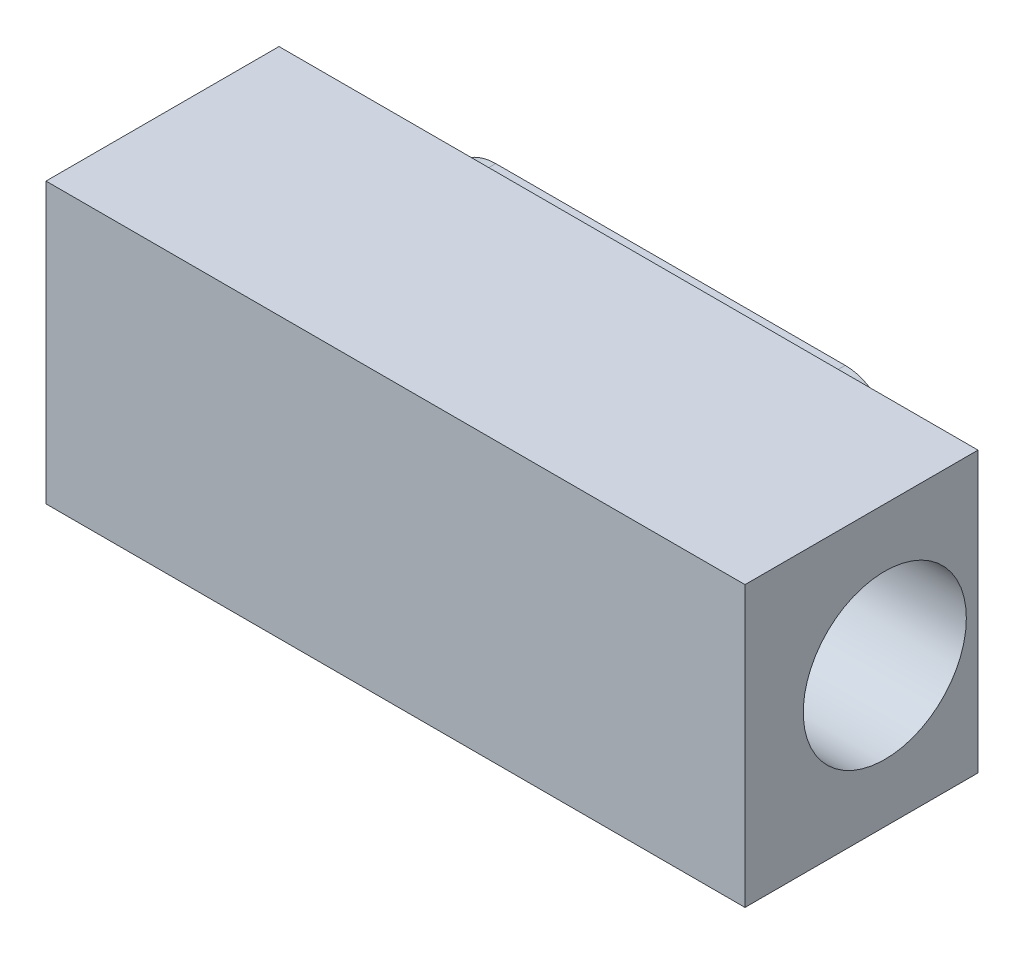
ISO-10303-21;
HEADER;
FILE_DESCRIPTION(('STEP AP214'),'2;1');
FILE_NAME('part.step','',(''),(''),'','','');
FILE_SCHEMA(('AUTOMOTIVE_DESIGN { 1 0 10303 214 1 1 1 1 }'));
ENDSEC;
DATA;
#1=APPLICATION_CONTEXT('core data for automotive mechanical design processes');
#2=APPLICATION_PROTOCOL_DEFINITION('international standard','automotive_design',2000,#1);
#3=PRODUCT_CONTEXT('',#1,'mechanical');
#4=PRODUCT('Part','Part','',(#3));
#5=PRODUCT_RELATED_PRODUCT_CATEGORY('part','',(#4));
#6=PRODUCT_DEFINITION_FORMATION('','',#4);
#7=PRODUCT_DEFINITION_CONTEXT('part definition',#1,'design');
#8=PRODUCT_DEFINITION('design','',#6,#7);
#9=PRODUCT_DEFINITION_SHAPE('','',#8);
#10=(LENGTH_UNIT() NAMED_UNIT(*) SI_UNIT(.MILLI.,.METRE.));
#11=(NAMED_UNIT(*) PLANE_ANGLE_UNIT() SI_UNIT($,.RADIAN.));
#12=(NAMED_UNIT(*) SI_UNIT($,.STERADIAN.) SOLID_ANGLE_UNIT());
#13=UNCERTAINTY_MEASURE_WITH_UNIT(LENGTH_MEASURE(1.E-05),#10,'distance_accuracy_value','');
#14=(GEOMETRIC_REPRESENTATION_CONTEXT(3) GLOBAL_UNCERTAINTY_ASSIGNED_CONTEXT((#13)) GLOBAL_UNIT_ASSIGNED_CONTEXT((#10,
#11,#12)) REPRESENTATION_CONTEXT('',''));
#15=CARTESIAN_POINT('',(0.,0.,0.));
#16=DIRECTION('',(0.,0.,1.));
#17=DIRECTION('',(1.,0.,0.));
#18=AXIS2_PLACEMENT_3D('',#15,#16,#17);
#19=CARTESIAN_POINT('',(-5.,0.,5.8));
#20=DIRECTION('',(1.,0.,0.));
#21=DIRECTION('',(0.,0.,-1.));
#22=AXIS2_PLACEMENT_3D('',#19,#20,#21);
#23=CYLINDRICAL_SURFACE('',#22,3.5);
#24=CARTESIAN_POINT('',(15.,0.,5.8));
#25=DIRECTION('',(1.,0.,0.));
#26=DIRECTION('',(0.,0.,-1.));
#27=AXIS2_PLACEMENT_3D('',#24,#25,#26);
#28=CIRCLE('',#27,3.5);
#29=CARTESIAN_POINT('',(15.,0.,2.3));
#30=VERTEX_POINT('',#29);
#31=EDGE_CURVE('E191',#30,#30,#28,.T.);
#32=ORIENTED_EDGE('',*,*,#31,.T.);
#33=EDGE_LOOP('',(#32));
#34=FACE_BOUND('',#33,.T.);
#35=DIRECTION('',(1.,0.,0.));
#36=VECTOR('',#35,1.);
#37=CARTESIAN_POINT('',(-5.,2.44948974278318,3.3));
#38=LINE('',#37,#36);
#39=CARTESIAN_POINT('',(8.,2.44948974278318,3.3));
#40=VERTEX_POINT('',#39);
#41=CARTESIAN_POINT('',(-5.,2.44948974278318,3.3));
#42=VERTEX_POINT('',#41);
#43=EDGE_CURVE('E48',#40,#42,#38,.F.);
#44=ORIENTED_EDGE('',*,*,#43,.F.);
#45=CARTESIAN_POINT('',(8.,0.,5.8));
#46=DIRECTION('',(-1.,0.,0.));
#47=DIRECTION('',(0.,0.,1.));
#48=AXIS2_PLACEMENT_3D('',#45,#46,#47);
#49=CIRCLE('',#48,3.5);
#50=CARTESIAN_POINT('',(8.,-2.44948974278318,3.3));
#51=VERTEX_POINT('',#50);
#52=EDGE_CURVE('E11',#51,#40,#49,.F.);
#53=ORIENTED_EDGE('',*,*,#52,.F.);
#54=DIRECTION('',(1.,0.,0.));
#55=VECTOR('',#54,1.);
#56=CARTESIAN_POINT('',(-5.,-2.44948974278318,3.3));
#57=LINE('',#56,#55);
#58=CARTESIAN_POINT('',(-5.,-2.44948974278318,3.3));
#59=VERTEX_POINT('',#58);
#60=EDGE_CURVE('E189',#59,#51,#57,.T.);
#61=ORIENTED_EDGE('',*,*,#60,.F.);
#62=CARTESIAN_POINT('',(-5.,0.,5.8));
#63=DIRECTION('',(1.,0.,0.));
#64=DIRECTION('',(0.,0.,-1.));
#65=AXIS2_PLACEMENT_3D('',#62,#63,#64);
#66=CIRCLE('',#65,3.5);
#67=EDGE_CURVE('E183',#42,#59,#66,.T.);
#68=ORIENTED_EDGE('',*,*,#67,.F.);
#69=EDGE_LOOP('',(#44,#53,#61,#68));
#70=FACE_BOUND('',#69,.T.);
#71=ADVANCED_FACE('F33',(#34,#70),#23,.F.);
#72=CARTESIAN_POINT('',(-5.,0.,5.8));
#73=DIRECTION('',(1.,0.,0.));
#74=DIRECTION('',(0.,0.,-1.));
#75=AXIS2_PLACEMENT_3D('',#72,#73,#74);
#76=PLANE('',#75);
#77=ORIENTED_EDGE('',*,*,#67,.T.);
#78=DIRECTION('',(0.,1.,0.));
#79=VECTOR('',#78,1.);
#80=CARTESIAN_POINT('',(-5.,0.,3.3));
#81=LINE('',#80,#79);
#82=EDGE_CURVE('E41',#59,#42,#81,.T.);
#83=ORIENTED_EDGE('',*,*,#82,.T.);
#84=EDGE_LOOP('',(#77,#83));
#85=FACE_BOUND('',#84,.T.);
#86=ADVANCED_FACE('F181',(#85),#76,.T.);
#87=CARTESIAN_POINT('',(7.5,-2.5,1.8));
#88=DIRECTION('',(0.,0.,-1.));
#89=DIRECTION('',(-1.,0.,0.));
#90=AXIS2_PLACEMENT_3D('',#87,#88,#89);
#91=CYLINDRICAL_SURFACE('',#90,2.);
#92=CARTESIAN_POINT('',(7.5,-2.5,0.));
#93=DIRECTION('',(0.,0.,1.));
#94=DIRECTION('',(1.,0.,0.));
#95=AXIS2_PLACEMENT_3D('',#92,#93,#94);
#96=CIRCLE('',#95,2.);
#97=CARTESIAN_POINT('',(7.49999999999999,-4.5,0.));
#98=VERTEX_POINT('',#97);
#99=CARTESIAN_POINT('',(9.5,-2.49999999999999,0.));
#100=VERTEX_POINT('',#99);
#101=EDGE_CURVE('E150',#98,#100,#96,.T.);
#102=ORIENTED_EDGE('',*,*,#101,.T.);
#103=DIRECTION('',(0.,0.,-1.));
#104=VECTOR('',#103,1.);
#105=CARTESIAN_POINT('',(9.5,-2.49999999999999,1.8));
#106=LINE('',#105,#104);
#107=CARTESIAN_POINT('',(9.5,-2.49999999999999,1.8));
#108=VERTEX_POINT('',#107);
#109=EDGE_CURVE('E177',#108,#100,#106,.T.);
#110=ORIENTED_EDGE('',*,*,#109,.F.);
#111=CARTESIAN_POINT('',(7.5,-2.5,1.8));
#112=DIRECTION('',(0.,0.,1.));
#113=DIRECTION('',(1.,0.,0.));
#114=AXIS2_PLACEMENT_3D('',#111,#112,#113);
#115=CIRCLE('',#114,2.);
#116=CARTESIAN_POINT('',(7.49999999999999,-4.5,1.8));
#117=VERTEX_POINT('',#116);
#118=EDGE_CURVE('E166',#117,#108,#115,.T.);
#119=ORIENTED_EDGE('',*,*,#118,.F.);
#120=DIRECTION('',(0.,0.,-1.));
#121=VECTOR('',#120,1.);
#122=CARTESIAN_POINT('',(7.49999999999999,-4.5,1.8));
#123=LINE('',#122,#121);
#124=EDGE_CURVE('E149',#117,#98,#123,.T.);
#125=ORIENTED_EDGE('',*,*,#124,.T.);
#126=EDGE_LOOP('',(#102,#110,#119,#125));
#127=FACE_BOUND('',#126,.T.);
#128=ADVANCED_FACE('F35',(#127),#91,.T.);
#129=CARTESIAN_POINT('',(9.5,2.49999999999998,1.8));
#130=DIRECTION('',(-1.,0.,0.));
#131=DIRECTION('',(0.,0.,1.));
#132=AXIS2_PLACEMENT_3D('',#129,#130,#131);
#133=PLANE('',#132);
#134=DIRECTION('',(0.,1.,0.));
#135=VECTOR('',#134,1.);
#136=CARTESIAN_POINT('',(9.5,2.49999999999998,0.));
#137=LINE('',#136,#135);
#138=CARTESIAN_POINT('',(9.5,2.49999999999999,0.));
#139=VERTEX_POINT('',#138);
#140=EDGE_CURVE('E153',#100,#139,#137,.T.);
#141=ORIENTED_EDGE('',*,*,#140,.T.);
#142=DIRECTION('',(0.,0.,-1.));
#143=VECTOR('',#142,1.);
#144=CARTESIAN_POINT('',(9.5,2.49999999999999,1.8));
#145=LINE('',#144,#143);
#146=CARTESIAN_POINT('',(9.5,2.49999999999999,1.8));
#147=VERTEX_POINT('',#146);
#148=EDGE_CURVE('E174',#147,#139,#145,.T.);
#149=ORIENTED_EDGE('',*,*,#148,.F.);
#150=DIRECTION('',(0.,1.,0.));
#151=VECTOR('',#150,1.);
#152=CARTESIAN_POINT('',(9.5,2.49999999999998,1.8));
#153=LINE('',#152,#151);
#154=EDGE_CURVE('E99',#108,#147,#153,.T.);
#155=ORIENTED_EDGE('',*,*,#154,.F.);
#156=ORIENTED_EDGE('',*,*,#109,.T.);
#157=EDGE_LOOP('',(#141,#149,#155,#156));
#158=FACE_BOUND('',#157,.T.);
#159=ADVANCED_FACE('F250',(#158),#133,.F.);
#160=CARTESIAN_POINT('',(7.5,2.5,1.8));
#161=DIRECTION('',(0.,0.,-1.));
#162=DIRECTION('',(-1.,0.,0.));
#163=AXIS2_PLACEMENT_3D('',#160,#161,#162);
#164=CYLINDRICAL_SURFACE('',#163,2.);
#165=CARTESIAN_POINT('',(7.5,2.5,0.));
#166=DIRECTION('',(0.,0.,1.));
#167=DIRECTION('',(-1.,0.,0.));
#168=AXIS2_PLACEMENT_3D('',#165,#166,#167);
#169=CIRCLE('',#168,2.);
#170=CARTESIAN_POINT('',(7.49999999999999,4.5,0.));
#171=VERTEX_POINT('',#170);
#172=EDGE_CURVE('E156',#139,#171,#169,.T.);
#173=ORIENTED_EDGE('',*,*,#172,.T.);
#174=DIRECTION('',(0.,0.,-1.));
#175=VECTOR('',#174,1.);
#176=CARTESIAN_POINT('',(7.49999999999999,4.5,1.8));
#177=LINE('',#176,#175);
#178=CARTESIAN_POINT('',(7.49999999999999,4.5,1.8));
#179=VERTEX_POINT('',#178);
#180=EDGE_CURVE('E171',#179,#171,#177,.T.);
#181=ORIENTED_EDGE('',*,*,#180,.F.);
#182=CARTESIAN_POINT('',(7.5,2.5,1.8));
#183=DIRECTION('',(0.,0.,1.));
#184=DIRECTION('',(-1.,0.,0.));
#185=AXIS2_PLACEMENT_3D('',#182,#183,#184);
#186=CIRCLE('',#185,2.);
#187=EDGE_CURVE('E142',#147,#179,#186,.T.);
#188=ORIENTED_EDGE('',*,*,#187,.F.);
#189=ORIENTED_EDGE('',*,*,#148,.T.);
#190=EDGE_LOOP('',(#173,#181,#188,#189));
#191=FACE_BOUND('',#190,.T.);
#192=ADVANCED_FACE('F236',(#191),#164,.T.);
#193=CARTESIAN_POINT('',(-7.49999999999998,4.5,1.8));
#194=DIRECTION('',(0.,-1.,0.));
#195=DIRECTION('',(0.,0.,-1.));
#196=AXIS2_PLACEMENT_3D('',#193,#194,#195);
#197=PLANE('',#196);
#198=DIRECTION('',(-1.,0.,0.));
#199=VECTOR('',#198,1.);
#200=CARTESIAN_POINT('',(-7.49999999999998,4.5,0.));
#201=LINE('',#200,#199);
#202=CARTESIAN_POINT('',(-7.49999999999998,4.5,0.));
#203=VERTEX_POINT('',#202);
#204=EDGE_CURVE('E158',#171,#203,#201,.T.);
#205=ORIENTED_EDGE('',*,*,#204,.T.);
#206=DIRECTION('',(0.,0.,-1.));
#207=VECTOR('',#206,1.);
#208=CARTESIAN_POINT('',(-7.49999999999998,4.5,1.8));
#209=LINE('',#208,#207);
#210=CARTESIAN_POINT('',(-7.49999999999998,4.5,1.8));
#211=VERTEX_POINT('',#210);
#212=EDGE_CURVE('E125',#211,#203,#209,.T.);
#213=ORIENTED_EDGE('',*,*,#212,.F.);
#214=DIRECTION('',(-1.,0.,0.));
#215=VECTOR('',#214,1.);
#216=CARTESIAN_POINT('',(-7.49999999999998,4.5,1.8));
#217=LINE('',#216,#215);
#218=EDGE_CURVE('E140',#179,#211,#217,.T.);
#219=ORIENTED_EDGE('',*,*,#218,.F.);
#220=ORIENTED_EDGE('',*,*,#180,.T.);
#221=EDGE_LOOP('',(#205,#213,#219,#220));
#222=FACE_BOUND('',#221,.T.);
#223=ADVANCED_FACE('F240',(#222),#197,.F.);
#224=CARTESIAN_POINT('',(-7.5,2.5,1.8));
#225=DIRECTION('',(0.,0.,-1.));
#226=DIRECTION('',(-1.,0.,0.));
#227=AXIS2_PLACEMENT_3D('',#224,#225,#226);
#228=CYLINDRICAL_SURFACE('',#227,2.);
#229=CARTESIAN_POINT('',(-7.5,2.5,0.));
#230=DIRECTION('',(0.,0.,1.));
#231=DIRECTION('',(1.,0.,0.));
#232=AXIS2_PLACEMENT_3D('',#229,#230,#231);
#233=CIRCLE('',#232,2.);
#234=CARTESIAN_POINT('',(-9.5,2.49999999999998,0.));
#235=VERTEX_POINT('',#234);
#236=EDGE_CURVE('E122',#203,#235,#233,.T.);
#237=ORIENTED_EDGE('',*,*,#236,.T.);
#238=DIRECTION('',(0.,0.,-1.));
#239=VECTOR('',#238,1.);
#240=CARTESIAN_POINT('',(-9.5,2.49999999999998,1.8));
#241=LINE('',#240,#239);
#242=CARTESIAN_POINT('',(-9.5,2.49999999999998,1.8));
#243=VERTEX_POINT('',#242);
#244=EDGE_CURVE('E114',#243,#235,#241,.T.);
#245=ORIENTED_EDGE('',*,*,#244,.F.);
#246=CARTESIAN_POINT('',(-7.5,2.5,1.8));
#247=DIRECTION('',(0.,0.,1.));
#248=DIRECTION('',(1.,0.,0.));
#249=AXIS2_PLACEMENT_3D('',#246,#247,#248);
#250=CIRCLE('',#249,2.);
#251=EDGE_CURVE('E119',#211,#243,#250,.T.);
#252=ORIENTED_EDGE('',*,*,#251,.F.);
#253=ORIENTED_EDGE('',*,*,#212,.T.);
#254=EDGE_LOOP('',(#237,#245,#252,#253));
#255=FACE_BOUND('',#254,.T.);
#256=ADVANCED_FACE('F116',(#255),#228,.T.);
#257=CARTESIAN_POINT('',(-9.5,2.49999999999998,1.8));
#258=DIRECTION('',(1.,0.,0.));
#259=DIRECTION('',(0.,0.,-1.));
#260=AXIS2_PLACEMENT_3D('',#257,#258,#259);
#261=PLANE('',#260);
#262=DIRECTION('',(0.,-1.,0.));
#263=VECTOR('',#262,1.);
#264=CARTESIAN_POINT('',(-9.5,2.49999999999998,0.));
#265=LINE('',#264,#263);
#266=CARTESIAN_POINT('',(-9.5,-2.49999999999999,0.));
#267=VERTEX_POINT('',#266);
#268=EDGE_CURVE('E161',#235,#267,#265,.T.);
#269=ORIENTED_EDGE('',*,*,#268,.T.);
#270=DIRECTION('',(0.,0.,-1.));
#271=VECTOR('',#270,1.);
#272=CARTESIAN_POINT('',(-9.5,-2.49999999999999,1.8));
#273=LINE('',#272,#271);
#274=CARTESIAN_POINT('',(-9.5,-2.49999999999999,1.8));
#275=VERTEX_POINT('',#274);
#276=EDGE_CURVE('E126',#275,#267,#273,.T.);
#277=ORIENTED_EDGE('',*,*,#276,.F.);
#278=DIRECTION('',(0.,-1.,0.));
#279=VECTOR('',#278,1.);
#280=CARTESIAN_POINT('',(-9.5,2.49999999999998,1.8));
#281=LINE('',#280,#279);
#282=EDGE_CURVE('E129',#243,#275,#281,.T.);
#283=ORIENTED_EDGE('',*,*,#282,.F.);
#284=ORIENTED_EDGE('',*,*,#244,.T.);
#285=EDGE_LOOP('',(#269,#277,#283,#284));
#286=FACE_BOUND('',#285,.T.);
#287=ADVANCED_FACE('F130',(#286),#261,.F.);
#288=CARTESIAN_POINT('',(-7.5,-2.5,1.8));
#289=DIRECTION('',(0.,0.,-1.));
#290=DIRECTION('',(-1.,0.,0.));
#291=AXIS2_PLACEMENT_3D('',#288,#289,#290);
#292=CYLINDRICAL_SURFACE('',#291,2.);
#293=CARTESIAN_POINT('',(-7.5,-2.5,0.));
#294=DIRECTION('',(0.,0.,1.));
#295=DIRECTION('',(1.,0.,0.));
#296=AXIS2_PLACEMENT_3D('',#293,#294,#295);
#297=CIRCLE('',#296,2.);
#298=CARTESIAN_POINT('',(-7.49999999999998,-4.5,0.));
#299=VERTEX_POINT('',#298);
#300=EDGE_CURVE('E163',#267,#299,#297,.T.);
#301=ORIENTED_EDGE('',*,*,#300,.T.);
#302=DIRECTION('',(0.,0.,-1.));
#303=VECTOR('',#302,1.);
#304=CARTESIAN_POINT('',(-7.49999999999998,-4.5,1.8));
#305=LINE('',#304,#303);
#306=CARTESIAN_POINT('',(-7.49999999999998,-4.5,1.8));
#307=VERTEX_POINT('',#306);
#308=EDGE_CURVE('E57',#307,#299,#305,.T.);
#309=ORIENTED_EDGE('',*,*,#308,.F.);
#310=CARTESIAN_POINT('',(-7.5,-2.5,1.8));
#311=DIRECTION('',(0.,0.,1.));
#312=DIRECTION('',(1.,0.,0.));
#313=AXIS2_PLACEMENT_3D('',#310,#311,#312);
#314=CIRCLE('',#313,2.);
#315=EDGE_CURVE('E134',#275,#307,#314,.T.);
#316=ORIENTED_EDGE('',*,*,#315,.F.);
#317=ORIENTED_EDGE('',*,*,#276,.T.);
#318=EDGE_LOOP('',(#301,#309,#316,#317));
#319=FACE_BOUND('',#318,.T.);
#320=ADVANCED_FACE('F245',(#319),#292,.T.);
#321=CARTESIAN_POINT('',(-7.49999999999998,-4.5,1.8));
#322=DIRECTION('',(0.,1.,0.));
#323=DIRECTION('',(0.,0.,1.));
#324=AXIS2_PLACEMENT_3D('',#321,#322,#323);
#325=PLANE('',#324);
#326=DIRECTION('',(1.,0.,0.));
#327=VECTOR('',#326,1.);
#328=CARTESIAN_POINT('',(-7.49999999999998,-4.5,0.));
#329=LINE('',#328,#327);
#330=EDGE_CURVE('E90',#299,#98,#329,.T.);
#331=ORIENTED_EDGE('',*,*,#330,.T.);
#332=ORIENTED_EDGE('',*,*,#124,.F.);
#333=DIRECTION('',(1.,0.,0.));
#334=VECTOR('',#333,1.);
#335=CARTESIAN_POINT('',(-7.49999999999998,-4.5,1.8));
#336=LINE('',#335,#334);
#337=EDGE_CURVE('E147',#307,#117,#336,.T.);
#338=ORIENTED_EDGE('',*,*,#337,.F.);
#339=ORIENTED_EDGE('',*,*,#308,.T.);
#340=EDGE_LOOP('',(#331,#332,#338,#339));
#341=FACE_BOUND('',#340,.T.);
#342=ADVANCED_FACE('F248',(#341),#325,.F.);
#343=CARTESIAN_POINT('',(7.5,-2.5,0.));
#344=DIRECTION('',(0.,0.,1.));
#345=DIRECTION('',(1.,0.,0.));
#346=AXIS2_PLACEMENT_3D('',#343,#344,#345);
#347=PLANE('',#346);
#348=ORIENTED_EDGE('',*,*,#101,.F.);
#349=ORIENTED_EDGE('',*,*,#330,.F.);
#350=ORIENTED_EDGE('',*,*,#300,.F.);
#351=ORIENTED_EDGE('',*,*,#268,.F.);
#352=ORIENTED_EDGE('',*,*,#236,.F.);
#353=ORIENTED_EDGE('',*,*,#204,.F.);
#354=ORIENTED_EDGE('',*,*,#172,.F.);
#355=ORIENTED_EDGE('',*,*,#140,.F.);
#356=EDGE_LOOP('',(#348,#349,#350,#351,#352,#353,#354,#355));
#357=FACE_BOUND('',#356,.T.);
#358=ADVANCED_FACE('F243',(#357),#347,.F.);
#359=CARTESIAN_POINT('',(0.,0.,1.8));
#360=DIRECTION('',(0.,0.,1.));
#361=DIRECTION('',(1.,0.,0.));
#362=AXIS2_PLACEMENT_3D('',#359,#360,#361);
#363=PLANE('',#362);
#364=DIRECTION('',(0.,1.,0.));
#365=VECTOR('',#364,1.);
#366=CARTESIAN_POINT('',(15.,6.,1.8));
#367=LINE('',#366,#365);
#368=CARTESIAN_POINT('',(15.,-6.,1.8));
#369=VERTEX_POINT('',#368);
#370=CARTESIAN_POINT('',(15.,6.,1.8));
#371=VERTEX_POINT('',#370);
#372=EDGE_CURVE('E190',#369,#371,#367,.T.);
#373=ORIENTED_EDGE('',*,*,#372,.F.);
#374=DIRECTION('',(1.,0.,0.));
#375=VECTOR('',#374,1.);
#376=CARTESIAN_POINT('',(-15.,-6.,1.8));
#377=LINE('',#376,#375);
#378=CARTESIAN_POINT('',(-15.,-6.,1.8));
#379=VERTEX_POINT('',#378);
#380=EDGE_CURVE('E205',#379,#369,#377,.T.);
#381=ORIENTED_EDGE('',*,*,#380,.F.);
#382=DIRECTION('',(0.,-1.,0.));
#383=VECTOR('',#382,1.);
#384=CARTESIAN_POINT('',(-15.,6.,1.8));
#385=LINE('',#384,#383);
#386=CARTESIAN_POINT('',(-15.,6.,1.8));
#387=VERTEX_POINT('',#386);
#388=EDGE_CURVE('E217',#387,#379,#385,.T.);
#389=ORIENTED_EDGE('',*,*,#388,.F.);
#390=DIRECTION('',(-1.,0.,0.));
#391=VECTOR('',#390,1.);
#392=CARTESIAN_POINT('',(-15.,6.,1.8));
#393=LINE('',#392,#391);
#394=EDGE_CURVE('E194',#371,#387,#393,.T.);
#395=ORIENTED_EDGE('',*,*,#394,.F.);
#396=EDGE_LOOP('',(#373,#381,#389,#395));
#397=FACE_BOUND('',#396,.T.);
#398=ORIENTED_EDGE('',*,*,#337,.T.);
#399=ORIENTED_EDGE('',*,*,#118,.T.);
#400=ORIENTED_EDGE('',*,*,#154,.T.);
#401=ORIENTED_EDGE('',*,*,#187,.T.);
#402=ORIENTED_EDGE('',*,*,#218,.T.);
#403=ORIENTED_EDGE('',*,*,#251,.T.);
#404=ORIENTED_EDGE('',*,*,#282,.T.);
#405=ORIENTED_EDGE('',*,*,#315,.T.);
#406=EDGE_LOOP('',(#398,#399,#400,#401,#402,#403,#404,#405));
#407=FACE_BOUND('',#406,.T.);
#408=ADVANCED_FACE('F137',(#397,#407),#363,.F.);
#409=CARTESIAN_POINT('',(15.,6.,11.8));
#410=DIRECTION('',(-1.,0.,0.));
#411=DIRECTION('',(0.,0.,1.));
#412=AXIS2_PLACEMENT_3D('',#409,#410,#411);
#413=PLANE('',#412);
#414=ORIENTED_EDGE('',*,*,#31,.F.);
#415=EDGE_LOOP('',(#414));
#416=FACE_BOUND('',#415,.T.);
#417=ORIENTED_EDGE('',*,*,#372,.T.);
#418=DIRECTION('',(0.,0.,-1.));
#419=VECTOR('',#418,1.);
#420=CARTESIAN_POINT('',(15.,6.,11.8));
#421=LINE('',#420,#419);
#422=CARTESIAN_POINT('',(15.,6.,11.8));
#423=VERTEX_POINT('',#422);
#424=EDGE_CURVE('E154',#423,#371,#421,.T.);
#425=ORIENTED_EDGE('',*,*,#424,.F.);
#426=DIRECTION('',(0.,1.,0.));
#427=VECTOR('',#426,1.);
#428=CARTESIAN_POINT('',(15.,6.,11.8));
#429=LINE('',#428,#427);
#430=CARTESIAN_POINT('',(15.,-6.,11.8));
#431=VERTEX_POINT('',#430);
#432=EDGE_CURVE('E201',#431,#423,#429,.T.);
#433=ORIENTED_EDGE('',*,*,#432,.F.);
#434=DIRECTION('',(0.,0.,-1.));
#435=VECTOR('',#434,1.);
#436=CARTESIAN_POINT('',(15.,-6.,11.8));
#437=LINE('',#436,#435);
#438=EDGE_CURVE('E213',#431,#369,#437,.T.);
#439=ORIENTED_EDGE('',*,*,#438,.T.);
#440=EDGE_LOOP('',(#417,#425,#433,#439));
#441=FACE_BOUND('',#440,.T.);
#442=ADVANCED_FACE('F274',(#416,#441),#413,.F.);
#443=CARTESIAN_POINT('',(-15.,6.,11.8));
#444=DIRECTION('',(0.,-1.,0.));
#445=DIRECTION('',(0.,0.,-1.));
#446=AXIS2_PLACEMENT_3D('',#443,#444,#445);
#447=PLANE('',#446);
#448=ORIENTED_EDGE('',*,*,#394,.T.);
#449=DIRECTION('',(0.,0.,-1.));
#450=VECTOR('',#449,1.);
#451=CARTESIAN_POINT('',(-15.,6.,11.8));
#452=LINE('',#451,#450);
#453=CARTESIAN_POINT('',(-15.,6.,11.8));
#454=VERTEX_POINT('',#453);
#455=EDGE_CURVE('E227',#454,#387,#452,.T.);
#456=ORIENTED_EDGE('',*,*,#455,.F.);
#457=DIRECTION('',(-1.,0.,0.));
#458=VECTOR('',#457,1.);
#459=CARTESIAN_POINT('',(-15.,6.,11.8));
#460=LINE('',#459,#458);
#461=EDGE_CURVE('E204',#423,#454,#460,.T.);
#462=ORIENTED_EDGE('',*,*,#461,.F.);
#463=ORIENTED_EDGE('',*,*,#424,.T.);
#464=EDGE_LOOP('',(#448,#456,#462,#463));
#465=FACE_BOUND('',#464,.T.);
#466=ADVANCED_FACE('F282',(#465),#447,.F.);
#467=CARTESIAN_POINT('',(-15.,6.,11.8));
#468=DIRECTION('',(1.,0.,0.));
#469=DIRECTION('',(0.,0.,-1.));
#470=AXIS2_PLACEMENT_3D('',#467,#468,#469);
#471=PLANE('',#470);
#472=ORIENTED_EDGE('',*,*,#388,.T.);
#473=DIRECTION('',(0.,0.,-1.));
#474=VECTOR('',#473,1.);
#475=CARTESIAN_POINT('',(-15.,-6.,11.8));
#476=LINE('',#475,#474);
#477=CARTESIAN_POINT('',(-15.,-6.,11.8));
#478=VERTEX_POINT('',#477);
#479=EDGE_CURVE('E224',#478,#379,#476,.T.);
#480=ORIENTED_EDGE('',*,*,#479,.F.);
#481=DIRECTION('',(0.,-1.,0.));
#482=VECTOR('',#481,1.);
#483=CARTESIAN_POINT('',(-15.,6.,11.8));
#484=LINE('',#483,#482);
#485=EDGE_CURVE('E208',#454,#478,#484,.T.);
#486=ORIENTED_EDGE('',*,*,#485,.F.);
#487=ORIENTED_EDGE('',*,*,#455,.T.);
#488=EDGE_LOOP('',(#472,#480,#486,#487));
#489=FACE_BOUND('',#488,.T.);
#490=ADVANCED_FACE('F278',(#489),#471,.F.);
#491=CARTESIAN_POINT('',(-15.,-6.,11.8));
#492=DIRECTION('',(0.,1.,0.));
#493=DIRECTION('',(0.,0.,1.));
#494=AXIS2_PLACEMENT_3D('',#491,#492,#493);
#495=PLANE('',#494);
#496=ORIENTED_EDGE('',*,*,#380,.T.);
#497=ORIENTED_EDGE('',*,*,#438,.F.);
#498=DIRECTION('',(1.,0.,0.));
#499=VECTOR('',#498,1.);
#500=CARTESIAN_POINT('',(-15.,-6.,11.8));
#501=LINE('',#500,#499);
#502=EDGE_CURVE('E211',#478,#431,#501,.T.);
#503=ORIENTED_EDGE('',*,*,#502,.F.);
#504=ORIENTED_EDGE('',*,*,#479,.T.);
#505=EDGE_LOOP('',(#496,#497,#503,#504));
#506=FACE_BOUND('',#505,.T.);
#507=ADVANCED_FACE('F270',(#506),#495,.F.);
#508=CARTESIAN_POINT('',(0.,0.,11.8));
#509=DIRECTION('',(0.,0.,1.));
#510=DIRECTION('',(1.,0.,0.));
#511=AXIS2_PLACEMENT_3D('',#508,#509,#510);
#512=PLANE('',#511);
#513=ORIENTED_EDGE('',*,*,#432,.T.);
#514=ORIENTED_EDGE('',*,*,#461,.T.);
#515=ORIENTED_EDGE('',*,*,#485,.T.);
#516=ORIENTED_EDGE('',*,*,#502,.T.);
#517=EDGE_LOOP('',(#513,#514,#515,#516));
#518=FACE_BOUND('',#517,.T.);
#519=ADVANCED_FACE('F266',(#518),#512,.T.);
#520=CARTESIAN_POINT('',(8.,-3.,0.8));
#521=DIRECTION('',(-1.,0.,0.));
#522=DIRECTION('',(0.,0.,1.));
#523=AXIS2_PLACEMENT_3D('',#520,#521,#522);
#524=PLANE('',#523);
#525=ORIENTED_EDGE('',*,*,#52,.T.);
#526=DIRECTION('',(0.,-1.,0.));
#527=VECTOR('',#526,1.);
#528=CARTESIAN_POINT('',(8.,-3.,3.3));
#529=LINE('',#528,#527);
#530=CARTESIAN_POINT('',(8.,3.,3.3));
#531=VERTEX_POINT('',#530);
#532=EDGE_CURVE('E504',#531,#40,#529,.T.);
#533=ORIENTED_EDGE('',*,*,#532,.F.);
#534=DIRECTION('',(0.,0.,1.));
#535=VECTOR('',#534,1.);
#536=CARTESIAN_POINT('',(8.,3.,0.8));
#537=LINE('',#536,#535);
#538=CARTESIAN_POINT('',(8.,3.,0.8));
#539=VERTEX_POINT('',#538);
#540=EDGE_CURVE('E485',#539,#531,#537,.T.);
#541=ORIENTED_EDGE('',*,*,#540,.F.);
#542=DIRECTION('',(0.,-1.,0.));
#543=VECTOR('',#542,1.);
#544=CARTESIAN_POINT('',(8.,-3.,0.8));
#545=LINE('',#544,#543);
#546=CARTESIAN_POINT('',(8.,-3.,0.8));
#547=VERTEX_POINT('',#546);
#548=EDGE_CURVE('E461',#539,#547,#545,.T.);
#549=ORIENTED_EDGE('',*,*,#548,.T.);
#550=DIRECTION('',(0.,0.,1.));
#551=VECTOR('',#550,1.);
#552=CARTESIAN_POINT('',(8.,-3.,0.8));
#553=LINE('',#552,#551);
#554=CARTESIAN_POINT('',(8.,-3.,3.3));
#555=VERTEX_POINT('',#554);
#556=EDGE_CURVE('E494',#547,#555,#553,.T.);
#557=ORIENTED_EDGE('',*,*,#556,.T.);
#558=EDGE_CURVE('E500',#51,#555,#529,.T.);
#559=ORIENTED_EDGE('',*,*,#558,.F.);
#560=EDGE_LOOP('',(#525,#533,#541,#549,#557,#559));
#561=FACE_BOUND('',#560,.T.);
#562=ADVANCED_FACE('F269',(#561),#524,.T.);
#563=CARTESIAN_POINT('',(0.,0.,3.3));
#564=DIRECTION('',(0.,0.,-1.));
#565=DIRECTION('',(-1.,0.,0.));
#566=AXIS2_PLACEMENT_3D('',#563,#564,#565);
#567=PLANE('',#566);
#568=ORIENTED_EDGE('',*,*,#43,.T.);
#569=ORIENTED_EDGE('',*,*,#82,.F.);
#570=ORIENTED_EDGE('',*,*,#60,.T.);
#571=ORIENTED_EDGE('',*,*,#558,.T.);
#572=DIRECTION('',(-1.,0.,0.));
#573=VECTOR('',#572,1.);
#574=CARTESIAN_POINT('',(-8.,-3.,3.3));
#575=LINE('',#574,#573);
#576=CARTESIAN_POINT('',(-8.,-3.,3.3));
#577=VERTEX_POINT('',#576);
#578=EDGE_CURVE('E506',#555,#577,#575,.T.);
#579=ORIENTED_EDGE('',*,*,#578,.T.);
#580=DIRECTION('',(0.,1.,0.));
#581=VECTOR('',#580,1.);
#582=CARTESIAN_POINT('',(-8.,-3.,3.3));
#583=LINE('',#582,#581);
#584=CARTESIAN_POINT('',(-8.,3.,3.3));
#585=VERTEX_POINT('',#584);
#586=EDGE_CURVE('E478',#577,#585,#583,.T.);
#587=ORIENTED_EDGE('',*,*,#586,.T.);
#588=DIRECTION('',(1.,0.,0.));
#589=VECTOR('',#588,1.);
#590=CARTESIAN_POINT('',(-8.,3.,3.3));
#591=LINE('',#590,#589);
#592=EDGE_CURVE('E473',#585,#531,#591,.T.);
#593=ORIENTED_EDGE('',*,*,#592,.T.);
#594=ORIENTED_EDGE('',*,*,#532,.T.);
#595=EDGE_LOOP('',(#568,#569,#570,#571,#579,#587,#593,#594));
#596=FACE_BOUND('',#595,.T.);
#597=ADVANCED_FACE('F356',(#596),#567,.T.);
#598=CARTESIAN_POINT('',(-8.,-3.,0.8));
#599=DIRECTION('',(0.,1.,0.));
#600=DIRECTION('',(-1.,0.,0.));
#601=AXIS2_PLACEMENT_3D('',#598,#599,#600);
#602=PLANE('',#601);
#603=ORIENTED_EDGE('',*,*,#556,.F.);
#604=DIRECTION('',(-1.,0.,0.));
#605=VECTOR('',#604,1.);
#606=CARTESIAN_POINT('',(-8.,-3.,0.8));
#607=LINE('',#606,#605);
#608=CARTESIAN_POINT('',(-8.,-3.,0.8));
#609=VERTEX_POINT('',#608);
#610=EDGE_CURVE('E468',#547,#609,#607,.T.);
#611=ORIENTED_EDGE('',*,*,#610,.T.);
#612=DIRECTION('',(0.,0.,1.));
#613=VECTOR('',#612,1.);
#614=CARTESIAN_POINT('',(-8.,-3.,0.8));
#615=LINE('',#614,#613);
#616=EDGE_CURVE('E491',#609,#577,#615,.T.);
#617=ORIENTED_EDGE('',*,*,#616,.T.);
#618=ORIENTED_EDGE('',*,*,#578,.F.);
#619=EDGE_LOOP('',(#603,#611,#617,#618));
#620=FACE_BOUND('',#619,.T.);
#621=ADVANCED_FACE('F364',(#620),#602,.T.);
#622=CARTESIAN_POINT('',(-8.,-3.,0.8));
#623=DIRECTION('',(1.,0.,0.));
#624=DIRECTION('',(0.,0.,-1.));
#625=AXIS2_PLACEMENT_3D('',#622,#623,#624);
#626=PLANE('',#625);
#627=ORIENTED_EDGE('',*,*,#616,.F.);
#628=DIRECTION('',(0.,1.,0.));
#629=VECTOR('',#628,1.);
#630=CARTESIAN_POINT('',(-8.,-3.,0.8));
#631=LINE('',#630,#629);
#632=CARTESIAN_POINT('',(-8.,3.,0.8));
#633=VERTEX_POINT('',#632);
#634=EDGE_CURVE('E475',#609,#633,#631,.T.);
#635=ORIENTED_EDGE('',*,*,#634,.T.);
#636=DIRECTION('',(0.,0.,1.));
#637=VECTOR('',#636,1.);
#638=CARTESIAN_POINT('',(-8.,3.,0.8));
#639=LINE('',#638,#637);
#640=EDGE_CURVE('E488',#633,#585,#639,.T.);
#641=ORIENTED_EDGE('',*,*,#640,.T.);
#642=ORIENTED_EDGE('',*,*,#586,.F.);
#643=EDGE_LOOP('',(#627,#635,#641,#642));
#644=FACE_BOUND('',#643,.T.);
#645=ADVANCED_FACE('F371',(#644),#626,.T.);
#646=CARTESIAN_POINT('',(-8.,3.,0.8));
#647=DIRECTION('',(0.,-1.,0.));
#648=DIRECTION('',(1.,0.,0.));
#649=AXIS2_PLACEMENT_3D('',#646,#647,#648);
#650=PLANE('',#649);
#651=ORIENTED_EDGE('',*,*,#640,.F.);
#652=DIRECTION('',(1.,0.,0.));
#653=VECTOR('',#652,1.);
#654=CARTESIAN_POINT('',(-8.,3.,0.8));
#655=LINE('',#654,#653);
#656=EDGE_CURVE('E465',#633,#539,#655,.T.);
#657=ORIENTED_EDGE('',*,*,#656,.T.);
#658=ORIENTED_EDGE('',*,*,#540,.T.);
#659=ORIENTED_EDGE('',*,*,#592,.F.);
#660=EDGE_LOOP('',(#651,#657,#658,#659));
#661=FACE_BOUND('',#660,.T.);
#662=ADVANCED_FACE('F379',(#661),#650,.T.);
#663=CARTESIAN_POINT('',(0.,0.,0.8));
#664=DIRECTION('',(0.,0.,-1.));
#665=DIRECTION('',(-1.,0.,0.));
#666=AXIS2_PLACEMENT_3D('',#663,#664,#665);
#667=PLANE('',#666);
#668=ORIENTED_EDGE('',*,*,#548,.F.);
#669=ORIENTED_EDGE('',*,*,#656,.F.);
#670=ORIENTED_EDGE('',*,*,#634,.F.);
#671=ORIENTED_EDGE('',*,*,#610,.F.);
#672=EDGE_LOOP('',(#668,#669,#670,#671));
#673=FACE_BOUND('',#672,.T.);
#674=ADVANCED_FACE('F387',(#673),#667,.F.);
#675=CLOSED_SHELL('',(#71,#86,#128,#159,#192,#223,#256,#287,#320,#342,#358,#408,#442,#466,#490,
#507,#519,#562,#597,#621,#645,#662,#674));
#676=MANIFOLD_SOLID_BREP('B2',#675);
#677=ADVANCED_BREP_SHAPE_REPRESENTATION('',(#18,#676),#14);
#678=SHAPE_DEFINITION_REPRESENTATION(#9,#677);
ENDSEC;
END-ISO-10303-21;
